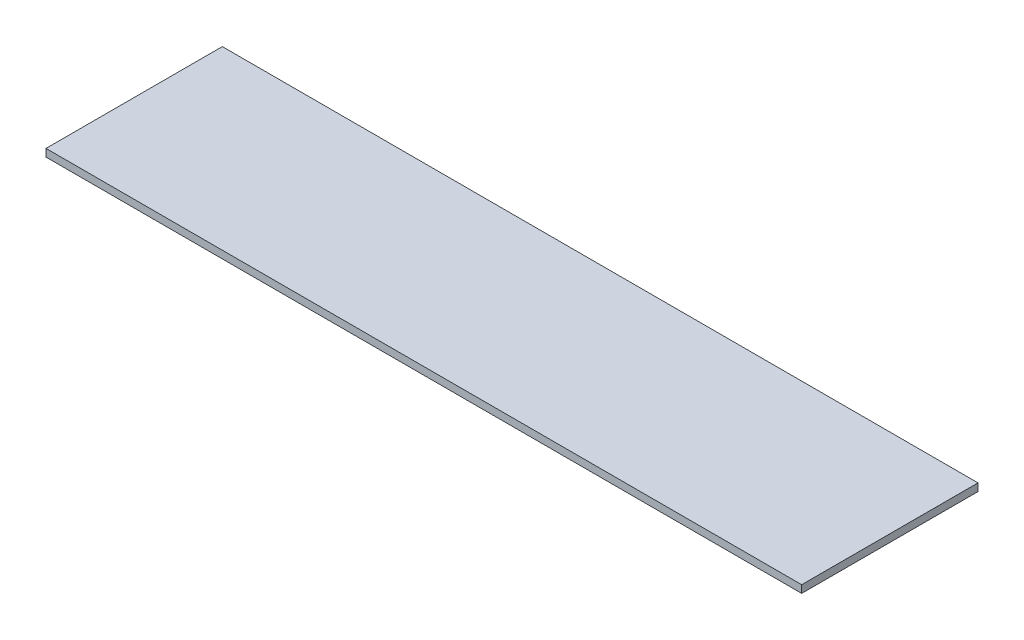
ISO-10303-21;
HEADER;
FILE_DESCRIPTION(('STEP AP214'),'2;1');
FILE_NAME('part.step','',(''),(''),'','','');
FILE_SCHEMA(('AUTOMOTIVE_DESIGN { 1 0 10303 214 1 1 1 1 }'));
ENDSEC;
DATA;
#1=APPLICATION_CONTEXT('core data for automotive mechanical design processes');
#2=APPLICATION_PROTOCOL_DEFINITION('international standard','automotive_design',2000,#1);
#3=PRODUCT_CONTEXT('',#1,'mechanical');
#4=PRODUCT('Part','Part','',(#3));
#5=PRODUCT_RELATED_PRODUCT_CATEGORY('part','',(#4));
#6=PRODUCT_DEFINITION_FORMATION('','',#4);
#7=PRODUCT_DEFINITION_CONTEXT('part definition',#1,'design');
#8=PRODUCT_DEFINITION('design','',#6,#7);
#9=PRODUCT_DEFINITION_SHAPE('','',#8);
#10=(LENGTH_UNIT() NAMED_UNIT(*) SI_UNIT(.MILLI.,.METRE.));
#11=(NAMED_UNIT(*) PLANE_ANGLE_UNIT() SI_UNIT($,.RADIAN.));
#12=(NAMED_UNIT(*) SI_UNIT($,.STERADIAN.) SOLID_ANGLE_UNIT());
#13=UNCERTAINTY_MEASURE_WITH_UNIT(LENGTH_MEASURE(1.E-05),#10,'distance_accuracy_value','');
#14=(GEOMETRIC_REPRESENTATION_CONTEXT(3) GLOBAL_UNCERTAINTY_ASSIGNED_CONTEXT((#13)) GLOBAL_UNIT_ASSIGNED_CONTEXT((#10,
#11,#12)) REPRESENTATION_CONTEXT('',''));
#15=CARTESIAN_POINT('',(0.,0.,0.));
#16=DIRECTION('',(0.,0.,1.));
#17=DIRECTION('',(1.,0.,0.));
#18=AXIS2_PLACEMENT_3D('',#15,#16,#17);
#19=CARTESIAN_POINT('',(-1500.,30.,-350.));
#20=DIRECTION('',(1.,0.,0.));
#21=DIRECTION('',(0.,0.,-1.));
#22=AXIS2_PLACEMENT_3D('',#19,#20,#21);
#23=PLANE('',#22);
#24=DIRECTION('',(0.,0.,1.));
#25=VECTOR('',#24,1.);
#26=CARTESIAN_POINT('',(-1500.,0.,-350.));
#27=LINE('',#26,#25);
#28=CARTESIAN_POINT('',(-1500.,0.,-350.));
#29=VERTEX_POINT('',#28);
#30=CARTESIAN_POINT('',(-1500.,0.,350.));
#31=VERTEX_POINT('',#30);
#32=EDGE_CURVE('E96',#29,#31,#27,.T.);
#33=ORIENTED_EDGE('',*,*,#32,.T.);
#34=DIRECTION('',(0.,-1.,0.));
#35=VECTOR('',#34,1.);
#36=CARTESIAN_POINT('',(-1500.,30.,350.));
#37=LINE('',#36,#35);
#38=CARTESIAN_POINT('',(-1500.,30.,350.));
#39=VERTEX_POINT('',#38);
#40=EDGE_CURVE('E11',#39,#31,#37,.T.);
#41=ORIENTED_EDGE('',*,*,#40,.F.);
#42=DIRECTION('',(0.,0.,1.));
#43=VECTOR('',#42,1.);
#44=CARTESIAN_POINT('',(-1500.,30.,-350.));
#45=LINE('',#44,#43);
#46=CARTESIAN_POINT('',(-1500.,30.,-350.));
#47=VERTEX_POINT('',#46);
#48=EDGE_CURVE('E84',#47,#39,#45,.T.);
#49=ORIENTED_EDGE('',*,*,#48,.F.);
#50=DIRECTION('',(0.,-1.,0.));
#51=VECTOR('',#50,1.);
#52=CARTESIAN_POINT('',(-1500.,30.,-350.));
#53=LINE('',#52,#51);
#54=EDGE_CURVE('E92',#47,#29,#53,.T.);
#55=ORIENTED_EDGE('',*,*,#54,.T.);
#56=EDGE_LOOP('',(#33,#41,#49,#55));
#57=FACE_BOUND('',#56,.T.);
#58=ADVANCED_FACE('F33',(#57),#23,.F.);
#59=CARTESIAN_POINT('',(-1500.,30.,350.));
#60=DIRECTION('',(0.,0.,-1.));
#61=DIRECTION('',(-1.,0.,0.));
#62=AXIS2_PLACEMENT_3D('',#59,#60,#61);
#63=PLANE('',#62);
#64=DIRECTION('',(1.,0.,0.));
#65=VECTOR('',#64,1.);
#66=CARTESIAN_POINT('',(-1500.,0.,350.));
#67=LINE('',#66,#65);
#68=CARTESIAN_POINT('',(1500.,0.,350.));
#69=VERTEX_POINT('',#68);
#70=EDGE_CURVE('E88',#31,#69,#67,.T.);
#71=ORIENTED_EDGE('',*,*,#70,.T.);
#72=DIRECTION('',(0.,-1.,0.));
#73=VECTOR('',#72,1.);
#74=CARTESIAN_POINT('',(1500.,30.,350.));
#75=LINE('',#74,#73);
#76=CARTESIAN_POINT('',(1500.,30.,350.));
#77=VERTEX_POINT('',#76);
#78=EDGE_CURVE('E41',#77,#69,#75,.T.);
#79=ORIENTED_EDGE('',*,*,#78,.F.);
#80=DIRECTION('',(1.,0.,0.));
#81=VECTOR('',#80,1.);
#82=CARTESIAN_POINT('',(-1500.,30.,350.));
#83=LINE('',#82,#81);
#84=EDGE_CURVE('E79',#39,#77,#83,.T.);
#85=ORIENTED_EDGE('',*,*,#84,.F.);
#86=ORIENTED_EDGE('',*,*,#40,.T.);
#87=EDGE_LOOP('',(#71,#79,#85,#86));
#88=FACE_BOUND('',#87,.T.);
#89=ADVANCED_FACE('F87',(#88),#63,.F.);
#90=CARTESIAN_POINT('',(1500.,30.,-350.));
#91=DIRECTION('',(-1.,0.,0.));
#92=DIRECTION('',(0.,0.,1.));
#93=AXIS2_PLACEMENT_3D('',#90,#91,#92);
#94=PLANE('',#93);
#95=DIRECTION('',(0.,0.,-1.));
#96=VECTOR('',#95,1.);
#97=CARTESIAN_POINT('',(1500.,0.,-350.));
#98=LINE('',#97,#96);
#99=CARTESIAN_POINT('',(1500.,0.,-350.));
#100=VERTEX_POINT('',#99);
#101=EDGE_CURVE('E66',#69,#100,#98,.T.);
#102=ORIENTED_EDGE('',*,*,#101,.T.);
#103=DIRECTION('',(0.,-1.,0.));
#104=VECTOR('',#103,1.);
#105=CARTESIAN_POINT('',(1500.,30.,-350.));
#106=LINE('',#105,#104);
#107=CARTESIAN_POINT('',(1500.,30.,-350.));
#108=VERTEX_POINT('',#107);
#109=EDGE_CURVE('E89',#108,#100,#106,.T.);
#110=ORIENTED_EDGE('',*,*,#109,.F.);
#111=DIRECTION('',(0.,0.,-1.));
#112=VECTOR('',#111,1.);
#113=CARTESIAN_POINT('',(1500.,30.,-350.));
#114=LINE('',#113,#112);
#115=EDGE_CURVE('E82',#77,#108,#114,.T.);
#116=ORIENTED_EDGE('',*,*,#115,.F.);
#117=ORIENTED_EDGE('',*,*,#78,.T.);
#118=EDGE_LOOP('',(#102,#110,#116,#117));
#119=FACE_BOUND('',#118,.T.);
#120=ADVANCED_FACE('F90',(#119),#94,.F.);
#121=CARTESIAN_POINT('',(-1500.,30.,-350.));
#122=DIRECTION('',(0.,0.,1.));
#123=DIRECTION('',(1.,0.,0.));
#124=AXIS2_PLACEMENT_3D('',#121,#122,#123);
#125=PLANE('',#124);
#126=DIRECTION('',(-1.,0.,0.));
#127=VECTOR('',#126,1.);
#128=CARTESIAN_POINT('',(-1500.,0.,-350.));
#129=LINE('',#128,#127);
#130=EDGE_CURVE('E72',#100,#29,#129,.T.);
#131=ORIENTED_EDGE('',*,*,#130,.T.);
#132=ORIENTED_EDGE('',*,*,#54,.F.);
#133=DIRECTION('',(-1.,0.,0.));
#134=VECTOR('',#133,1.);
#135=CARTESIAN_POINT('',(-1500.,30.,-350.));
#136=LINE('',#135,#134);
#137=EDGE_CURVE('E49',#108,#47,#136,.T.);
#138=ORIENTED_EDGE('',*,*,#137,.F.);
#139=ORIENTED_EDGE('',*,*,#109,.T.);
#140=EDGE_LOOP('',(#131,#132,#138,#139));
#141=FACE_BOUND('',#140,.T.);
#142=ADVANCED_FACE('F103',(#141),#125,.F.);
#143=CARTESIAN_POINT('',(0.,30.,0.));
#144=DIRECTION('',(0.,1.,0.));
#145=DIRECTION('',(0.,0.,1.));
#146=AXIS2_PLACEMENT_3D('',#143,#144,#145);
#147=PLANE('',#146);
#148=ORIENTED_EDGE('',*,*,#48,.T.);
#149=ORIENTED_EDGE('',*,*,#84,.T.);
#150=ORIENTED_EDGE('',*,*,#115,.T.);
#151=ORIENTED_EDGE('',*,*,#137,.T.);
#152=EDGE_LOOP('',(#148,#149,#150,#151));
#153=FACE_BOUND('',#152,.T.);
#154=ADVANCED_FACE('F80',(#153),#147,.T.);
#155=CARTESIAN_POINT('',(0.,0.,0.));
#156=DIRECTION('',(0.,1.,0.));
#157=DIRECTION('',(0.,0.,1.));
#158=AXIS2_PLACEMENT_3D('',#155,#156,#157);
#159=PLANE('',#158);
#160=ORIENTED_EDGE('',*,*,#32,.F.);
#161=ORIENTED_EDGE('',*,*,#130,.F.);
#162=ORIENTED_EDGE('',*,*,#101,.F.);
#163=ORIENTED_EDGE('',*,*,#70,.F.);
#164=EDGE_LOOP('',(#160,#161,#162,#163));
#165=FACE_BOUND('',#164,.T.);
#166=ADVANCED_FACE('F106',(#165),#159,.F.);
#167=CLOSED_SHELL('',(#58,#89,#120,#142,#154,#166));
#168=MANIFOLD_SOLID_BREP('B2',#167);
#169=ADVANCED_BREP_SHAPE_REPRESENTATION('',(#18,#168),#14);
#170=SHAPE_DEFINITION_REPRESENTATION(#9,#169);
ENDSEC;
END-ISO-10303-21;
